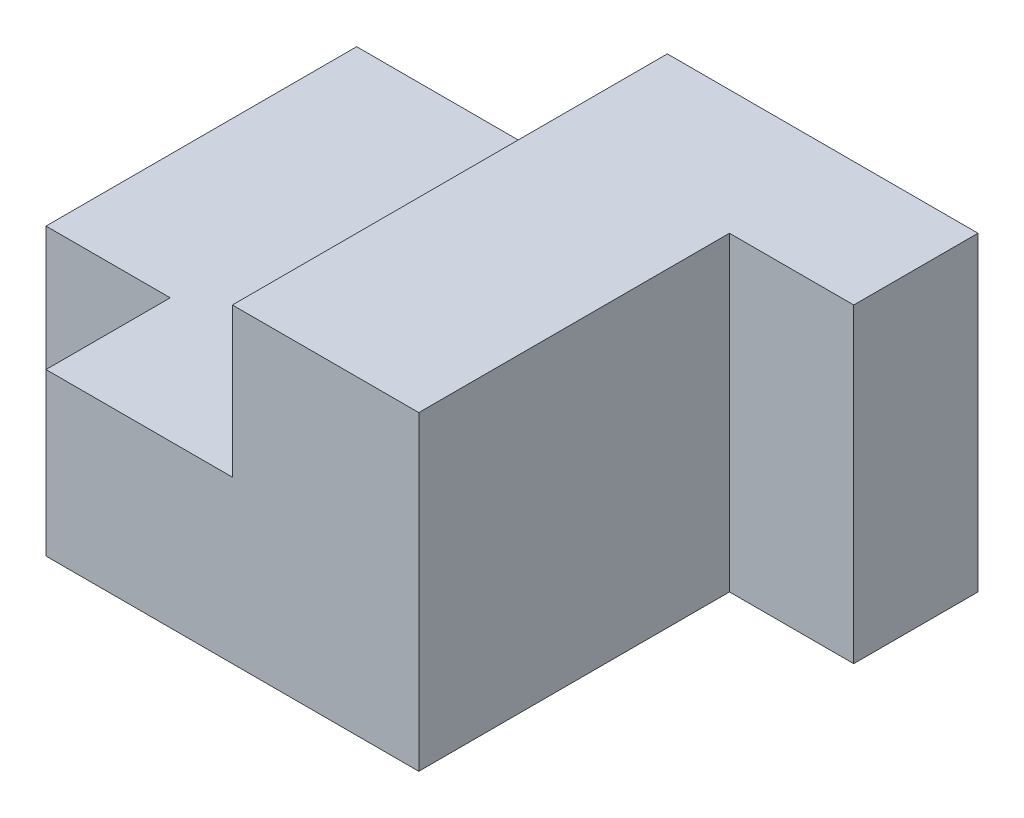
ISO-10303-21;
HEADER;
FILE_DESCRIPTION(('STEP AP214'),'2;1');
FILE_NAME('part.step','',(''),(''),'','','');
FILE_SCHEMA(('AUTOMOTIVE_DESIGN { 1 0 10303 214 1 1 1 1 }'));
ENDSEC;
DATA;
#1=APPLICATION_CONTEXT('core data for automotive mechanical design processes');
#2=APPLICATION_PROTOCOL_DEFINITION('international standard','automotive_design',2000,#1);
#3=PRODUCT_CONTEXT('',#1,'mechanical');
#4=PRODUCT('Part','Part','',(#3));
#5=PRODUCT_RELATED_PRODUCT_CATEGORY('part','',(#4));
#6=PRODUCT_DEFINITION_FORMATION('','',#4);
#7=PRODUCT_DEFINITION_CONTEXT('part definition',#1,'design');
#8=PRODUCT_DEFINITION('design','',#6,#7);
#9=PRODUCT_DEFINITION_SHAPE('','',#8);
#10=(LENGTH_UNIT() NAMED_UNIT(*) SI_UNIT(.MILLI.,.METRE.));
#11=(NAMED_UNIT(*) PLANE_ANGLE_UNIT() SI_UNIT($,.RADIAN.));
#12=(NAMED_UNIT(*) SI_UNIT($,.STERADIAN.) SOLID_ANGLE_UNIT());
#13=UNCERTAINTY_MEASURE_WITH_UNIT(LENGTH_MEASURE(1.E-05),#10,'distance_accuracy_value','');
#14=(GEOMETRIC_REPRESENTATION_CONTEXT(3) GLOBAL_UNCERTAINTY_ASSIGNED_CONTEXT((#13)) GLOBAL_UNIT_ASSIGNED_CONTEXT((#10,
#11,#12)) REPRESENTATION_CONTEXT('',''));
#15=CARTESIAN_POINT('',(0.,0.,0.));
#16=DIRECTION('',(0.,0.,1.));
#17=DIRECTION('',(1.,0.,0.));
#18=AXIS2_PLACEMENT_3D('',#15,#16,#17);
#19=CARTESIAN_POINT('',(-133.026980357152,76.8310896768964,70.));
#20=DIRECTION('',(1.,0.,0.));
#21=DIRECTION('',(0.,0.,-1.));
#22=AXIS2_PLACEMENT_3D('',#19,#20,#21);
#23=PLANE('',#22);
#24=DIRECTION('',(0.,-1.,0.));
#25=VECTOR('',#24,1.);
#26=CARTESIAN_POINT('',(-133.026980357152,76.8310896768964,50.));
#27=LINE('',#26,#25);
#28=CARTESIAN_POINT('',(-133.026980357152,76.8310896768964,50.));
#29=VERTEX_POINT('',#28);
#30=CARTESIAN_POINT('',(-133.026980357152,50.8310896768964,50.));
#31=VERTEX_POINT('',#30);
#32=EDGE_CURVE('E110',#29,#31,#27,.T.);
#33=ORIENTED_EDGE('',*,*,#32,.F.);
#34=DIRECTION('',(0.,0.,-1.));
#35=VECTOR('',#34,1.);
#36=CARTESIAN_POINT('',(-133.026980357152,76.8310896768964,70.));
#37=LINE('',#36,#35);
#38=CARTESIAN_POINT('',(-133.026980357152,76.8310896768964,0.));
#39=VERTEX_POINT('',#38);
#40=EDGE_CURVE('E133',#29,#39,#37,.T.);
#41=ORIENTED_EDGE('',*,*,#40,.T.);
#42=DIRECTION('',(0.,-1.,0.));
#43=VECTOR('',#42,1.);
#44=CARTESIAN_POINT('',(-133.026980357152,76.8310896768964,0.));
#45=LINE('',#44,#43);
#46=CARTESIAN_POINT('',(-133.026980357152,50.8310896768964,0.));
#47=VERTEX_POINT('',#46);
#48=EDGE_CURVE('E131',#39,#47,#45,.T.);
#49=ORIENTED_EDGE('',*,*,#48,.T.);
#50=DIRECTION('',(0.,0.,-1.));
#51=VECTOR('',#50,1.);
#52=CARTESIAN_POINT('',(-133.026980357152,50.8310896768964,70.));
#53=LINE('',#52,#51);
#54=EDGE_CURVE('E126',#31,#47,#53,.T.);
#55=ORIENTED_EDGE('',*,*,#54,.F.);
#56=EDGE_LOOP('',(#33,#41,#49,#55));
#57=FACE_BOUND('',#56,.T.);
#58=ADVANCED_FACE('F33',(#57),#23,.F.);
#59=CARTESIAN_POINT('',(-33.0269803571522,50.8310896768964,70.));
#60=DIRECTION('',(-1.,0.,0.));
#61=DIRECTION('',(0.,0.,1.));
#62=AXIS2_PLACEMENT_3D('',#59,#60,#61);
#63=PLANE('',#62);
#64=DIRECTION('',(0.,0.,-1.));
#65=VECTOR('',#64,1.);
#66=CARTESIAN_POINT('',(-33.0269803571522,100.831089676896,70.));
#67=LINE('',#66,#65);
#68=CARTESIAN_POINT('',(-33.0269803571522,100.831089676896,20.));
#69=VERTEX_POINT('',#68);
#70=CARTESIAN_POINT('',(-33.0269803571522,100.831089676896,0.));
#71=VERTEX_POINT('',#70);
#72=EDGE_CURVE('E11',#69,#71,#67,.T.);
#73=ORIENTED_EDGE('',*,*,#72,.F.);
#74=DIRECTION('',(0.,1.,0.));
#75=VECTOR('',#74,1.);
#76=CARTESIAN_POINT('',(-33.0269803571522,100.831089676896,20.));
#77=LINE('',#76,#75);
#78=CARTESIAN_POINT('',(-33.0269803571522,50.8310896768964,20.));
#79=VERTEX_POINT('',#78);
#80=EDGE_CURVE('E190',#79,#69,#77,.T.);
#81=ORIENTED_EDGE('',*,*,#80,.F.);
#82=DIRECTION('',(0.,0.,-1.));
#83=VECTOR('',#82,1.);
#84=CARTESIAN_POINT('',(-33.0269803571522,50.8310896768964,70.));
#85=LINE('',#84,#83);
#86=CARTESIAN_POINT('',(-33.0269803571522,50.8310896768964,0.));
#87=VERTEX_POINT('',#86);
#88=EDGE_CURVE('E134',#79,#87,#85,.T.);
#89=ORIENTED_EDGE('',*,*,#88,.T.);
#90=DIRECTION('',(0.,1.,0.));
#91=VECTOR('',#90,1.);
#92=CARTESIAN_POINT('',(-33.0269803571522,50.8310896768964,0.));
#93=LINE('',#92,#91);
#94=EDGE_CURVE('E165',#87,#71,#93,.T.);
#95=ORIENTED_EDGE('',*,*,#94,.T.);
#96=EDGE_LOOP('',(#73,#81,#89,#95));
#97=FACE_BOUND('',#96,.T.);
#98=ADVANCED_FACE('F35',(#97),#63,.F.);
#99=CARTESIAN_POINT('',(-33.0269803571522,100.831089676896,70.));
#100=DIRECTION('',(0.,-1.,0.));
#101=DIRECTION('',(0.,0.,-1.));
#102=AXIS2_PLACEMENT_3D('',#99,#100,#101);
#103=PLANE('',#102);
#104=DIRECTION('',(-1.,0.,0.));
#105=VECTOR('',#104,1.);
#106=CARTESIAN_POINT('',(-33.0269803571522,100.831089676896,70.));
#107=LINE('',#106,#105);
#108=CARTESIAN_POINT('',(-53.0269803571522,100.831089676896,70.));
#109=VERTEX_POINT('',#108);
#110=CARTESIAN_POINT('',(-83.0269803571522,100.831089676896,70.));
#111=VERTEX_POINT('',#110);
#112=EDGE_CURVE('E170',#109,#111,#107,.T.);
#113=ORIENTED_EDGE('',*,*,#112,.F.);
#114=DIRECTION('',(0.,0.,1.));
#115=VECTOR('',#114,1.);
#116=CARTESIAN_POINT('',(-53.0269803571522,100.831089676896,20.));
#117=LINE('',#116,#115);
#118=CARTESIAN_POINT('',(-53.0269803571522,100.831089676896,20.));
#119=VERTEX_POINT('',#118);
#120=EDGE_CURVE('E56',#119,#109,#117,.T.);
#121=ORIENTED_EDGE('',*,*,#120,.F.);
#122=DIRECTION('',(-1.,0.,0.));
#123=VECTOR('',#122,1.);
#124=CARTESIAN_POINT('',(-33.0269803571522,100.831089676896,20.));
#125=LINE('',#124,#123);
#126=EDGE_CURVE('E196',#69,#119,#125,.T.);
#127=ORIENTED_EDGE('',*,*,#126,.F.);
#128=ORIENTED_EDGE('',*,*,#72,.T.);
#129=DIRECTION('',(-1.,0.,0.));
#130=VECTOR('',#129,1.);
#131=CARTESIAN_POINT('',(-33.0269803571522,100.831089676896,0.));
#132=LINE('',#131,#130);
#133=CARTESIAN_POINT('',(-83.0269803571522,100.831089676896,0.));
#134=VERTEX_POINT('',#133);
#135=EDGE_CURVE('E159',#71,#134,#132,.T.);
#136=ORIENTED_EDGE('',*,*,#135,.T.);
#137=DIRECTION('',(0.,0.,-1.));
#138=VECTOR('',#137,1.);
#139=CARTESIAN_POINT('',(-83.0269803571522,100.831089676896,70.));
#140=LINE('',#139,#138);
#141=EDGE_CURVE('E41',#111,#134,#140,.T.);
#142=ORIENTED_EDGE('',*,*,#141,.F.);
#143=EDGE_LOOP('',(#113,#121,#127,#128,#136,#142));
#144=FACE_BOUND('',#143,.T.);
#145=ADVANCED_FACE('F226',(#144),#103,.F.);
#146=CARTESIAN_POINT('',(-83.0269803571522,100.831089676896,70.));
#147=DIRECTION('',(1.,0.,0.));
#148=DIRECTION('',(0.,1.,0.));
#149=AXIS2_PLACEMENT_3D('',#146,#147,#148);
#150=PLANE('',#149);
#151=DIRECTION('',(0.,-1.,0.));
#152=VECTOR('',#151,1.);
#153=CARTESIAN_POINT('',(-83.0269803571522,100.831089676896,0.));
#154=LINE('',#153,#152);
#155=CARTESIAN_POINT('',(-83.0269803571523,76.8310896768964,0.));
#156=VERTEX_POINT('',#155);
#157=EDGE_CURVE('E150',#134,#156,#154,.T.);
#158=ORIENTED_EDGE('',*,*,#157,.T.);
#159=DIRECTION('',(0.,0.,-1.));
#160=VECTOR('',#159,1.);
#161=CARTESIAN_POINT('',(-83.0269803571523,76.8310896768964,70.));
#162=LINE('',#161,#160);
#163=CARTESIAN_POINT('',(-83.0269803571523,76.8310896768964,70.));
#164=VERTEX_POINT('',#163);
#165=EDGE_CURVE('E136',#164,#156,#162,.T.);
#166=ORIENTED_EDGE('',*,*,#165,.F.);
#167=DIRECTION('',(0.,-1.,0.));
#168=VECTOR('',#167,1.);
#169=CARTESIAN_POINT('',(-83.0269803571522,100.831089676896,70.));
#170=LINE('',#169,#168);
#171=EDGE_CURVE('E151',#111,#164,#170,.T.);
#172=ORIENTED_EDGE('',*,*,#171,.F.);
#173=ORIENTED_EDGE('',*,*,#141,.T.);
#174=EDGE_LOOP('',(#158,#166,#172,#173));
#175=FACE_BOUND('',#174,.T.);
#176=ADVANCED_FACE('F148',(#175),#150,.F.);
#177=CARTESIAN_POINT('',(-83.0269803571523,76.8310896768964,70.));
#178=DIRECTION('',(0.,-1.,0.));
#179=DIRECTION('',(0.,0.,-1.));
#180=AXIS2_PLACEMENT_3D('',#177,#178,#179);
#181=PLANE('',#180);
#182=DIRECTION('',(-1.,0.,0.));
#183=VECTOR('',#182,1.);
#184=CARTESIAN_POINT('',(-133.026980357152,76.8310896768964,50.));
#185=LINE('',#184,#183);
#186=CARTESIAN_POINT('',(-113.026980357152,76.8310896768964,50.));
#187=VERTEX_POINT('',#186);
#188=EDGE_CURVE('E116',#187,#29,#185,.T.);
#189=ORIENTED_EDGE('',*,*,#188,.F.);
#190=DIRECTION('',(0.,0.,1.));
#191=VECTOR('',#190,1.);
#192=CARTESIAN_POINT('',(-113.026980357152,76.8310896768964,50.));
#193=LINE('',#192,#191);
#194=CARTESIAN_POINT('',(-113.026980357152,76.8310896768964,70.));
#195=VERTEX_POINT('',#194);
#196=EDGE_CURVE('E191',#187,#195,#193,.T.);
#197=ORIENTED_EDGE('',*,*,#196,.T.);
#198=DIRECTION('',(-1.,0.,0.));
#199=VECTOR('',#198,1.);
#200=CARTESIAN_POINT('',(-83.0269803571523,76.8310896768964,70.));
#201=LINE('',#200,#199);
#202=EDGE_CURVE('E174',#164,#195,#201,.T.);
#203=ORIENTED_EDGE('',*,*,#202,.F.);
#204=ORIENTED_EDGE('',*,*,#165,.T.);
#205=DIRECTION('',(-1.,0.,0.));
#206=VECTOR('',#205,1.);
#207=CARTESIAN_POINT('',(-83.0269803571523,76.8310896768964,0.));
#208=LINE('',#207,#206);
#209=EDGE_CURVE('E162',#156,#39,#208,.T.);
#210=ORIENTED_EDGE('',*,*,#209,.T.);
#211=ORIENTED_EDGE('',*,*,#40,.F.);
#212=EDGE_LOOP('',(#189,#197,#203,#204,#210,#211));
#213=FACE_BOUND('',#212,.T.);
#214=ADVANCED_FACE('F206',(#213),#181,.F.);
#215=CARTESIAN_POINT('',(-133.026980357152,50.8310896768964,70.));
#216=DIRECTION('',(0.,1.,0.));
#217=DIRECTION('',(0.,0.,1.));
#218=AXIS2_PLACEMENT_3D('',#215,#216,#217);
#219=PLANE('',#218);
#220=DIRECTION('',(1.,0.,0.));
#221=VECTOR('',#220,1.);
#222=CARTESIAN_POINT('',(-133.026980357152,50.8310896768964,70.));
#223=LINE('',#222,#221);
#224=CARTESIAN_POINT('',(-113.026980357152,50.8310896768964,70.));
#225=VERTEX_POINT('',#224);
#226=CARTESIAN_POINT('',(-53.0269803571522,50.8310896768964,70.));
#227=VERTEX_POINT('',#226);
#228=EDGE_CURVE('E138',#225,#227,#223,.T.);
#229=ORIENTED_EDGE('',*,*,#228,.F.);
#230=DIRECTION('',(0.,0.,1.));
#231=VECTOR('',#230,1.);
#232=CARTESIAN_POINT('',(-113.026980357152,50.8310896768964,50.));
#233=LINE('',#232,#231);
#234=CARTESIAN_POINT('',(-113.026980357152,50.8310896768964,50.));
#235=VERTEX_POINT('',#234);
#236=EDGE_CURVE('E48',#235,#225,#233,.T.);
#237=ORIENTED_EDGE('',*,*,#236,.F.);
#238=DIRECTION('',(1.,0.,0.));
#239=VECTOR('',#238,1.);
#240=CARTESIAN_POINT('',(-133.026980357152,50.8310896768964,50.));
#241=LINE('',#240,#239);
#242=EDGE_CURVE('E114',#31,#235,#241,.T.);
#243=ORIENTED_EDGE('',*,*,#242,.F.);
#244=ORIENTED_EDGE('',*,*,#54,.T.);
#245=DIRECTION('',(1.,0.,0.));
#246=VECTOR('',#245,1.);
#247=CARTESIAN_POINT('',(-133.026980357152,50.8310896768964,0.));
#248=LINE('',#247,#246);
#249=EDGE_CURVE('E169',#47,#87,#248,.T.);
#250=ORIENTED_EDGE('',*,*,#249,.T.);
#251=ORIENTED_EDGE('',*,*,#88,.F.);
#252=DIRECTION('',(1.,0.,0.));
#253=VECTOR('',#252,1.);
#254=CARTESIAN_POINT('',(-33.0269803571522,50.8310896768964,20.));
#255=LINE('',#254,#253);
#256=CARTESIAN_POINT('',(-53.0269803571522,50.8310896768964,20.));
#257=VERTEX_POINT('',#256);
#258=EDGE_CURVE('E186',#257,#79,#255,.T.);
#259=ORIENTED_EDGE('',*,*,#258,.F.);
#260=DIRECTION('',(0.,0.,1.));
#261=VECTOR('',#260,1.);
#262=CARTESIAN_POINT('',(-53.0269803571522,50.8310896768964,20.));
#263=LINE('',#262,#261);
#264=EDGE_CURVE('E181',#257,#227,#263,.T.);
#265=ORIENTED_EDGE('',*,*,#264,.T.);
#266=EDGE_LOOP('',(#229,#237,#243,#244,#250,#251,#259,#265));
#267=FACE_BOUND('',#266,.T.);
#268=ADVANCED_FACE('F124',(#267),#219,.F.);
#269=CARTESIAN_POINT('',(0.,0.,70.));
#270=DIRECTION('',(0.,0.,1.));
#271=DIRECTION('',(1.,0.,0.));
#272=AXIS2_PLACEMENT_3D('',#269,#270,#271);
#273=PLANE('',#272);
#274=DIRECTION('',(0.,1.,0.));
#275=VECTOR('',#274,1.);
#276=CARTESIAN_POINT('',(-113.026980357152,76.8310896768964,70.));
#277=LINE('',#276,#275);
#278=EDGE_CURVE('E120',#225,#195,#277,.T.);
#279=ORIENTED_EDGE('',*,*,#278,.F.);
#280=ORIENTED_EDGE('',*,*,#228,.T.);
#281=DIRECTION('',(0.,-1.,0.));
#282=VECTOR('',#281,1.);
#283=CARTESIAN_POINT('',(-53.0269803571522,100.831089676896,70.));
#284=LINE('',#283,#282);
#285=EDGE_CURVE('E188',#109,#227,#284,.T.);
#286=ORIENTED_EDGE('',*,*,#285,.F.);
#287=ORIENTED_EDGE('',*,*,#112,.T.);
#288=ORIENTED_EDGE('',*,*,#171,.T.);
#289=ORIENTED_EDGE('',*,*,#202,.T.);
#290=EDGE_LOOP('',(#279,#280,#286,#287,#288,#289));
#291=FACE_BOUND('',#290,.T.);
#292=ADVANCED_FACE('F208',(#291),#273,.T.);
#293=CARTESIAN_POINT('',(0.,0.,0.));
#294=DIRECTION('',(0.,0.,1.));
#295=DIRECTION('',(1.,0.,0.));
#296=AXIS2_PLACEMENT_3D('',#293,#294,#295);
#297=PLANE('',#296);
#298=ORIENTED_EDGE('',*,*,#94,.F.);
#299=ORIENTED_EDGE('',*,*,#249,.F.);
#300=ORIENTED_EDGE('',*,*,#48,.F.);
#301=ORIENTED_EDGE('',*,*,#209,.F.);
#302=ORIENTED_EDGE('',*,*,#157,.F.);
#303=ORIENTED_EDGE('',*,*,#135,.F.);
#304=EDGE_LOOP('',(#298,#299,#300,#301,#302,#303));
#305=FACE_BOUND('',#304,.T.);
#306=ADVANCED_FACE('F158',(#305),#297,.F.);
#307=CARTESIAN_POINT('',(-53.0269803571522,100.831089676896,20.));
#308=DIRECTION('',(-1.,0.,0.));
#309=DIRECTION('',(0.,-1.,0.));
#310=AXIS2_PLACEMENT_3D('',#307,#308,#309);
#311=PLANE('',#310);
#312=ORIENTED_EDGE('',*,*,#285,.T.);
#313=ORIENTED_EDGE('',*,*,#264,.F.);
#314=DIRECTION('',(0.,-1.,0.));
#315=VECTOR('',#314,1.);
#316=CARTESIAN_POINT('',(-53.0269803571522,100.831089676896,20.));
#317=LINE('',#316,#315);
#318=EDGE_CURVE('E193',#119,#257,#317,.T.);
#319=ORIENTED_EDGE('',*,*,#318,.F.);
#320=ORIENTED_EDGE('',*,*,#120,.T.);
#321=EDGE_LOOP('',(#312,#313,#319,#320));
#322=FACE_BOUND('',#321,.T.);
#323=ADVANCED_FACE('F218',(#322),#311,.F.);
#324=CARTESIAN_POINT('',(0.,0.,20.));
#325=DIRECTION('',(0.,0.,-1.));
#326=DIRECTION('',(-1.,0.,0.));
#327=AXIS2_PLACEMENT_3D('',#324,#325,#326);
#328=PLANE('',#327);
#329=ORIENTED_EDGE('',*,*,#80,.T.);
#330=ORIENTED_EDGE('',*,*,#126,.T.);
#331=ORIENTED_EDGE('',*,*,#318,.T.);
#332=ORIENTED_EDGE('',*,*,#258,.T.);
#333=EDGE_LOOP('',(#329,#330,#331,#332));
#334=FACE_BOUND('',#333,.T.);
#335=ADVANCED_FACE('F211',(#334),#328,.F.);
#336=CARTESIAN_POINT('',(-113.026980357152,76.8310896768964,50.));
#337=DIRECTION('',(1.,0.,0.));
#338=DIRECTION('',(0.,0.,-1.));
#339=AXIS2_PLACEMENT_3D('',#336,#337,#338);
#340=PLANE('',#339);
#341=ORIENTED_EDGE('',*,*,#278,.T.);
#342=ORIENTED_EDGE('',*,*,#196,.F.);
#343=DIRECTION('',(0.,1.,0.));
#344=VECTOR('',#343,1.);
#345=CARTESIAN_POINT('',(-113.026980357152,76.8310896768964,50.));
#346=LINE('',#345,#344);
#347=EDGE_CURVE('E128',#235,#187,#346,.T.);
#348=ORIENTED_EDGE('',*,*,#347,.F.);
#349=ORIENTED_EDGE('',*,*,#236,.T.);
#350=EDGE_LOOP('',(#341,#342,#348,#349));
#351=FACE_BOUND('',#350,.T.);
#352=ADVANCED_FACE('F209',(#351),#340,.F.);
#353=CARTESIAN_POINT('',(0.,0.,50.));
#354=DIRECTION('',(0.,0.,1.));
#355=DIRECTION('',(1.,0.,0.));
#356=AXIS2_PLACEMENT_3D('',#353,#354,#355);
#357=PLANE('',#356);
#358=ORIENTED_EDGE('',*,*,#32,.T.);
#359=ORIENTED_EDGE('',*,*,#242,.T.);
#360=ORIENTED_EDGE('',*,*,#347,.T.);
#361=ORIENTED_EDGE('',*,*,#188,.T.);
#362=EDGE_LOOP('',(#358,#359,#360,#361));
#363=FACE_BOUND('',#362,.T.);
#364=ADVANCED_FACE('F112',(#363),#357,.T.);
#365=CLOSED_SHELL('',(#58,#98,#145,#176,#214,#268,#292,#306,#323,#335,#352,#364));
#366=MANIFOLD_SOLID_BREP('B2',#365);
#367=ADVANCED_BREP_SHAPE_REPRESENTATION('',(#18,#366),#14);
#368=SHAPE_DEFINITION_REPRESENTATION(#9,#367);
ENDSEC;
END-ISO-10303-21;
